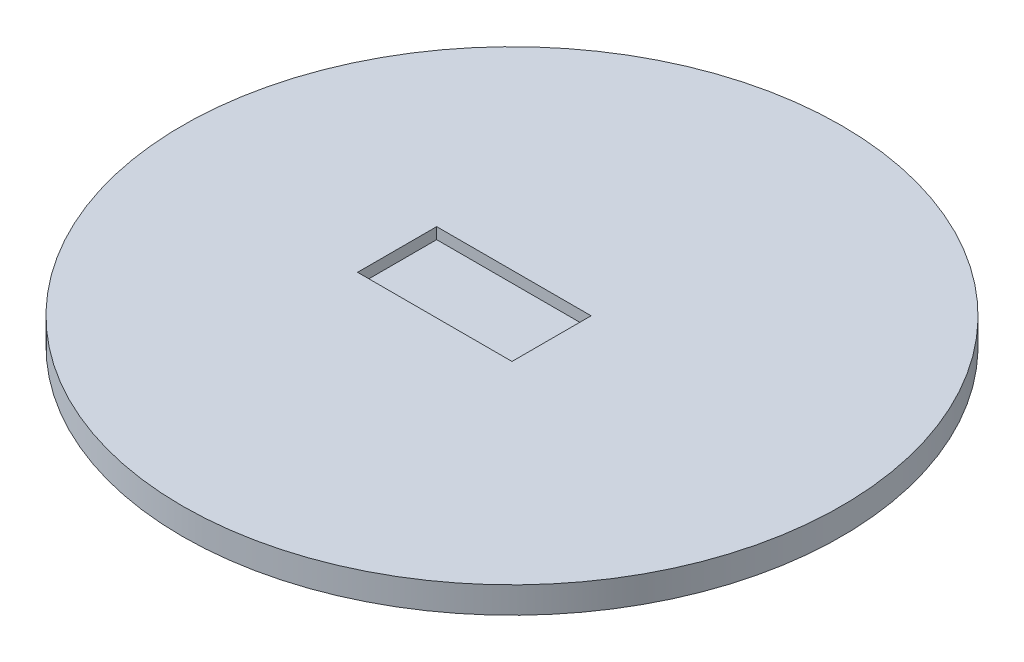
ISO-10303-21;
HEADER;
FILE_DESCRIPTION(('STEP AP214'),'2;1');
FILE_NAME('part.step','',(''),(''),'','','');
FILE_SCHEMA(('AUTOMOTIVE_DESIGN { 1 0 10303 214 1 1 1 1 }'));
ENDSEC;
DATA;
#1=APPLICATION_CONTEXT('core data for automotive mechanical design processes');
#2=APPLICATION_PROTOCOL_DEFINITION('international standard','automotive_design',2000,#1);
#3=PRODUCT_CONTEXT('',#1,'mechanical');
#4=PRODUCT('Part','Part','',(#3));
#5=PRODUCT_RELATED_PRODUCT_CATEGORY('part','',(#4));
#6=PRODUCT_DEFINITION_FORMATION('','',#4);
#7=PRODUCT_DEFINITION_CONTEXT('part definition',#1,'design');
#8=PRODUCT_DEFINITION('design','',#6,#7);
#9=PRODUCT_DEFINITION_SHAPE('','',#8);
#10=(LENGTH_UNIT() NAMED_UNIT(*) SI_UNIT(.MILLI.,.METRE.));
#11=(NAMED_UNIT(*) PLANE_ANGLE_UNIT() SI_UNIT($,.RADIAN.));
#12=(NAMED_UNIT(*) SI_UNIT($,.STERADIAN.) SOLID_ANGLE_UNIT());
#13=UNCERTAINTY_MEASURE_WITH_UNIT(LENGTH_MEASURE(1.E-05),#10,'distance_accuracy_value','');
#14=(GEOMETRIC_REPRESENTATION_CONTEXT(3) GLOBAL_UNCERTAINTY_ASSIGNED_CONTEXT((#13)) GLOBAL_UNIT_ASSIGNED_CONTEXT((#10,
#11,#12)) REPRESENTATION_CONTEXT('',''));
#15=CARTESIAN_POINT('',(0.,0.,0.));
#16=DIRECTION('',(0.,0.,1.));
#17=DIRECTION('',(1.,0.,0.));
#18=AXIS2_PLACEMENT_3D('',#15,#16,#17);
#19=CARTESIAN_POINT('',(0.,7.,0.));
#20=DIRECTION('',(0.,-1.,0.));
#21=DIRECTION('',(0.,0.,-1.));
#22=AXIS2_PLACEMENT_3D('',#19,#20,#21);
#23=CYLINDRICAL_SURFACE('',#22,87.5);
#24=CARTESIAN_POINT('',(0.,7.,0.));
#25=DIRECTION('',(0.,1.,0.));
#26=DIRECTION('',(0.,0.,1.));
#27=AXIS2_PLACEMENT_3D('',#24,#25,#26);
#28=CIRCLE('',#27,87.5);
#29=CARTESIAN_POINT('',(0.,7.,87.5));
#30=VERTEX_POINT('',#29);
#31=EDGE_CURVE('E11',#30,#30,#28,.T.);
#32=ORIENTED_EDGE('',*,*,#31,.F.);
#33=EDGE_LOOP('',(#32));
#34=FACE_BOUND('',#33,.T.);
#35=CARTESIAN_POINT('',(0.,0.,0.));
#36=DIRECTION('',(0.,1.,0.));
#37=DIRECTION('',(0.,0.,1.));
#38=AXIS2_PLACEMENT_3D('',#35,#36,#37);
#39=CIRCLE('',#38,87.5);
#40=CARTESIAN_POINT('',(0.,0.,87.5));
#41=VERTEX_POINT('',#40);
#42=EDGE_CURVE('E46',#41,#41,#39,.T.);
#43=ORIENTED_EDGE('',*,*,#42,.T.);
#44=EDGE_LOOP('',(#43));
#45=FACE_BOUND('',#44,.T.);
#46=ADVANCED_FACE('F43',(#34,#45),#23,.T.);
#47=CARTESIAN_POINT('',(0.,7.,0.));
#48=DIRECTION('',(0.,1.,0.));
#49=DIRECTION('',(0.,0.,1.));
#50=AXIS2_PLACEMENT_3D('',#47,#48,#49);
#51=PLANE('',#50);
#52=DIRECTION('',(0.,0.,-1.));
#53=VECTOR('',#52,1.);
#54=CARTESIAN_POINT('',(10.5,7.,-10.5));
#55=LINE('',#54,#53);
#56=CARTESIAN_POINT('',(10.5,7.,10.5));
#57=VERTEX_POINT('',#56);
#58=CARTESIAN_POINT('',(10.5,7.,-10.5));
#59=VERTEX_POINT('',#58);
#60=EDGE_CURVE('E58',#57,#59,#55,.T.);
#61=ORIENTED_EDGE('',*,*,#60,.F.);
#62=DIRECTION('',(1.,0.,0.));
#63=VECTOR('',#62,1.);
#64=CARTESIAN_POINT('',(-30.5,7.,10.5));
#65=LINE('',#64,#63);
#66=CARTESIAN_POINT('',(-30.5,7.,10.5));
#67=VERTEX_POINT('',#66);
#68=EDGE_CURVE('E113',#67,#57,#65,.T.);
#69=ORIENTED_EDGE('',*,*,#68,.F.);
#70=DIRECTION('',(0.,0.,1.));
#71=VECTOR('',#70,1.);
#72=CARTESIAN_POINT('',(-30.5,7.,-10.5));
#73=LINE('',#72,#71);
#74=CARTESIAN_POINT('',(-30.5,7.,-10.5));
#75=VERTEX_POINT('',#74);
#76=EDGE_CURVE('E122',#75,#67,#73,.T.);
#77=ORIENTED_EDGE('',*,*,#76,.F.);
#78=DIRECTION('',(-1.,0.,0.));
#79=VECTOR('',#78,1.);
#80=CARTESIAN_POINT('',(-30.5,7.,-10.5));
#81=LINE('',#80,#79);
#82=EDGE_CURVE('E93',#59,#75,#81,.T.);
#83=ORIENTED_EDGE('',*,*,#82,.F.);
#84=EDGE_LOOP('',(#61,#69,#77,#83));
#85=FACE_BOUND('',#84,.T.);
#86=ORIENTED_EDGE('',*,*,#31,.T.);
#87=EDGE_LOOP('',(#86));
#88=FACE_BOUND('',#87,.T.);
#89=ADVANCED_FACE('F133',(#85,#88),#51,.T.);
#90=CARTESIAN_POINT('',(0.,0.,0.));
#91=DIRECTION('',(0.,1.,0.));
#92=DIRECTION('',(0.,0.,1.));
#93=AXIS2_PLACEMENT_3D('',#90,#91,#92);
#94=PLANE('',#93);
#95=ORIENTED_EDGE('',*,*,#42,.F.);
#96=EDGE_LOOP('',(#95));
#97=FACE_BOUND('',#96,.T.);
#98=ADVANCED_FACE('F145',(#97),#94,.F.);
#99=CARTESIAN_POINT('',(10.5,4.,-10.5));
#100=DIRECTION('',(1.,0.,0.));
#101=DIRECTION('',(0.,0.,-1.));
#102=AXIS2_PLACEMENT_3D('',#99,#100,#101);
#103=PLANE('',#102);
#104=ORIENTED_EDGE('',*,*,#60,.T.);
#105=DIRECTION('',(0.,1.,0.));
#106=VECTOR('',#105,1.);
#107=CARTESIAN_POINT('',(10.5,4.,-10.5));
#108=LINE('',#107,#106);
#109=CARTESIAN_POINT('',(10.5,4.,-10.5));
#110=VERTEX_POINT('',#109);
#111=EDGE_CURVE('E81',#110,#59,#108,.T.);
#112=ORIENTED_EDGE('',*,*,#111,.F.);
#113=DIRECTION('',(0.,0.,-1.));
#114=VECTOR('',#113,1.);
#115=CARTESIAN_POINT('',(10.5,4.,-10.5));
#116=LINE('',#115,#114);
#117=CARTESIAN_POINT('',(10.5,4.,10.5));
#118=VERTEX_POINT('',#117);
#119=EDGE_CURVE('E109',#118,#110,#116,.T.);
#120=ORIENTED_EDGE('',*,*,#119,.F.);
#121=DIRECTION('',(0.,1.,0.));
#122=VECTOR('',#121,1.);
#123=CARTESIAN_POINT('',(10.5,4.,10.5));
#124=LINE('',#123,#122);
#125=EDGE_CURVE('E66',#118,#57,#124,.T.);
#126=ORIENTED_EDGE('',*,*,#125,.T.);
#127=EDGE_LOOP('',(#104,#112,#120,#126));
#128=FACE_BOUND('',#127,.T.);
#129=ADVANCED_FACE('F138',(#128),#103,.F.);
#130=CARTESIAN_POINT('',(-30.5,4.,10.5));
#131=DIRECTION('',(0.,0.,1.));
#132=DIRECTION('',(1.,0.,0.));
#133=AXIS2_PLACEMENT_3D('',#130,#131,#132);
#134=PLANE('',#133);
#135=ORIENTED_EDGE('',*,*,#68,.T.);
#136=ORIENTED_EDGE('',*,*,#125,.F.);
#137=DIRECTION('',(1.,0.,0.));
#138=VECTOR('',#137,1.);
#139=CARTESIAN_POINT('',(-30.5,4.,10.5));
#140=LINE('',#139,#138);
#141=CARTESIAN_POINT('',(-30.5,4.,10.5));
#142=VERTEX_POINT('',#141);
#143=EDGE_CURVE('E106',#142,#118,#140,.T.);
#144=ORIENTED_EDGE('',*,*,#143,.F.);
#145=DIRECTION('',(0.,1.,0.));
#146=VECTOR('',#145,1.);
#147=CARTESIAN_POINT('',(-30.5,4.,10.5));
#148=LINE('',#147,#146);
#149=EDGE_CURVE('E98',#142,#67,#148,.T.);
#150=ORIENTED_EDGE('',*,*,#149,.T.);
#151=EDGE_LOOP('',(#135,#136,#144,#150));
#152=FACE_BOUND('',#151,.T.);
#153=ADVANCED_FACE('F136',(#152),#134,.F.);
#154=CARTESIAN_POINT('',(-30.5,4.,-10.5));
#155=DIRECTION('',(-1.,0.,0.));
#156=DIRECTION('',(0.,0.,1.));
#157=AXIS2_PLACEMENT_3D('',#154,#155,#156);
#158=PLANE('',#157);
#159=ORIENTED_EDGE('',*,*,#76,.T.);
#160=ORIENTED_EDGE('',*,*,#149,.F.);
#161=DIRECTION('',(0.,0.,1.));
#162=VECTOR('',#161,1.);
#163=CARTESIAN_POINT('',(-30.5,4.,-10.5));
#164=LINE('',#163,#162);
#165=CARTESIAN_POINT('',(-30.5,4.,-10.5));
#166=VERTEX_POINT('',#165);
#167=EDGE_CURVE('E101',#166,#142,#164,.T.);
#168=ORIENTED_EDGE('',*,*,#167,.F.);
#169=DIRECTION('',(0.,1.,0.));
#170=VECTOR('',#169,1.);
#171=CARTESIAN_POINT('',(-30.5,4.,-10.5));
#172=LINE('',#171,#170);
#173=EDGE_CURVE('E86',#166,#75,#172,.T.);
#174=ORIENTED_EDGE('',*,*,#173,.T.);
#175=EDGE_LOOP('',(#159,#160,#168,#174));
#176=FACE_BOUND('',#175,.T.);
#177=ADVANCED_FACE('F102',(#176),#158,.F.);
#178=CARTESIAN_POINT('',(-30.5,4.,-10.5));
#179=DIRECTION('',(0.,0.,-1.));
#180=DIRECTION('',(-1.,0.,0.));
#181=AXIS2_PLACEMENT_3D('',#178,#179,#180);
#182=PLANE('',#181);
#183=ORIENTED_EDGE('',*,*,#82,.T.);
#184=ORIENTED_EDGE('',*,*,#173,.F.);
#185=DIRECTION('',(-1.,0.,0.));
#186=VECTOR('',#185,1.);
#187=CARTESIAN_POINT('',(-30.5,4.,-10.5));
#188=LINE('',#187,#186);
#189=EDGE_CURVE('E90',#110,#166,#188,.T.);
#190=ORIENTED_EDGE('',*,*,#189,.F.);
#191=ORIENTED_EDGE('',*,*,#111,.T.);
#192=EDGE_LOOP('',(#183,#184,#190,#191));
#193=FACE_BOUND('',#192,.T.);
#194=ADVANCED_FACE('F88',(#193),#182,.F.);
#195=CARTESIAN_POINT('',(0.,4.,0.));
#196=DIRECTION('',(0.,1.,0.));
#197=DIRECTION('',(0.,0.,1.));
#198=AXIS2_PLACEMENT_3D('',#195,#196,#197);
#199=PLANE('',#198);
#200=ORIENTED_EDGE('',*,*,#119,.T.);
#201=ORIENTED_EDGE('',*,*,#189,.T.);
#202=ORIENTED_EDGE('',*,*,#167,.T.);
#203=ORIENTED_EDGE('',*,*,#143,.T.);
#204=EDGE_LOOP('',(#200,#201,#202,#203));
#205=FACE_BOUND('',#204,.T.);
#206=ADVANCED_FACE('F108',(#205),#199,.T.);
#207=CLOSED_SHELL('',(#46,#89,#98,#129,#153,#177,#194,#206));
#208=MANIFOLD_SOLID_BREP('B2',#207);
#209=ADVANCED_BREP_SHAPE_REPRESENTATION('',(#18,#208),#14);
#210=SHAPE_DEFINITION_REPRESENTATION(#9,#209);
ENDSEC;
END-ISO-10303-21;
